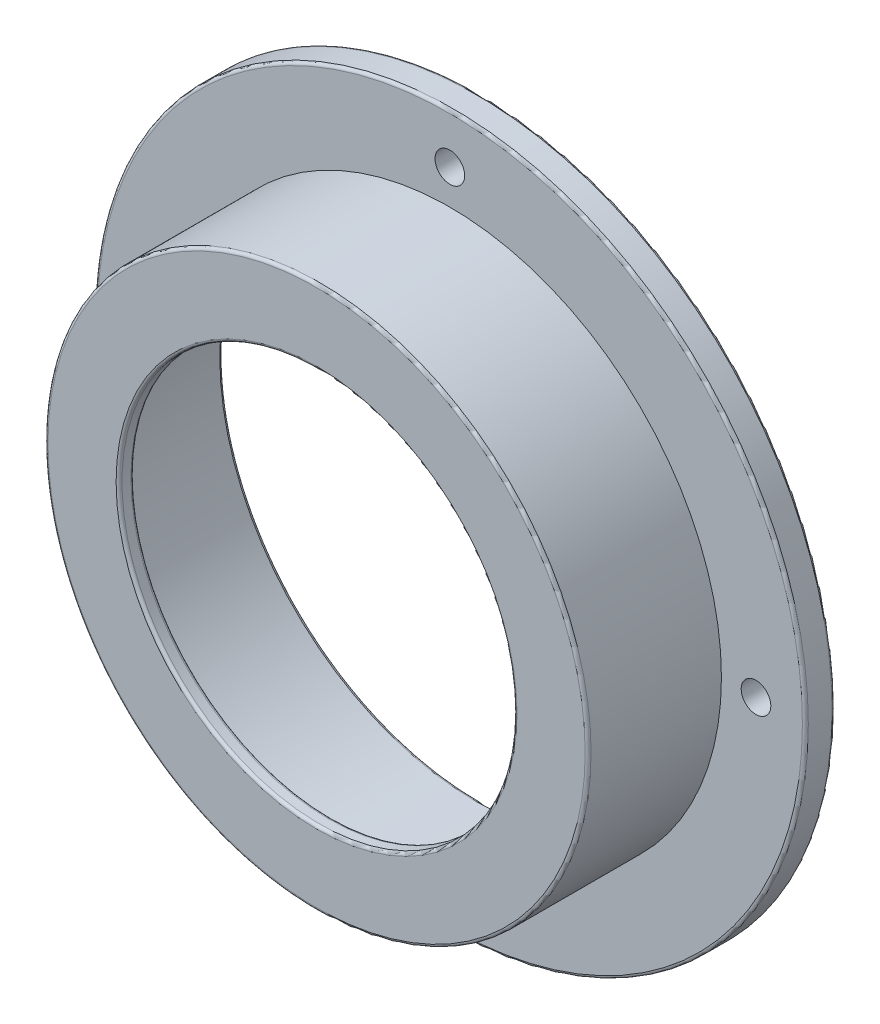
ISO-10303-21;
HEADER;
FILE_DESCRIPTION(('STEP AP214'),'2;1');
FILE_NAME('part.step','',(''),(''),'','','');
FILE_SCHEMA(('AUTOMOTIVE_DESIGN { 1 0 10303 214 1 1 1 1 }'));
ENDSEC;
DATA;
#1=APPLICATION_CONTEXT('core data for automotive mechanical design processes');
#2=APPLICATION_PROTOCOL_DEFINITION('international standard','automotive_design',2000,#1);
#3=PRODUCT_CONTEXT('',#1,'mechanical');
#4=PRODUCT('Part','Part','',(#3));
#5=PRODUCT_RELATED_PRODUCT_CATEGORY('part','',(#4));
#6=PRODUCT_DEFINITION_FORMATION('','',#4);
#7=PRODUCT_DEFINITION_CONTEXT('part definition',#1,'design');
#8=PRODUCT_DEFINITION('design','',#6,#7);
#9=PRODUCT_DEFINITION_SHAPE('','',#8);
#10=(LENGTH_UNIT() NAMED_UNIT(*) SI_UNIT(.MILLI.,.METRE.));
#11=(NAMED_UNIT(*) PLANE_ANGLE_UNIT() SI_UNIT($,.RADIAN.));
#12=(NAMED_UNIT(*) SI_UNIT($,.STERADIAN.) SOLID_ANGLE_UNIT());
#13=UNCERTAINTY_MEASURE_WITH_UNIT(LENGTH_MEASURE(1.E-05),#10,'distance_accuracy_value','');
#14=(GEOMETRIC_REPRESENTATION_CONTEXT(3) GLOBAL_UNCERTAINTY_ASSIGNED_CONTEXT((#13)) GLOBAL_UNIT_ASSIGNED_CONTEXT((#10,
#11,#12)) REPRESENTATION_CONTEXT('',''));
#15=CARTESIAN_POINT('',(0.,0.,0.));
#16=DIRECTION('',(0.,0.,1.));
#17=DIRECTION('',(1.,0.,0.));
#18=AXIS2_PLACEMENT_3D('',#15,#16,#17);
#19=CARTESIAN_POINT('',(0.,0.,3.));
#20=DIRECTION('',(0.,0.,-1.));
#21=DIRECTION('',(-1.,0.,0.));
#22=AXIS2_PLACEMENT_3D('',#19,#20,#21);
#23=CYLINDRICAL_SURFACE('',#22,36.);
#24=CARTESIAN_POINT('',(0.,0.,2.7));
#25=DIRECTION('',(0.,0.,1.));
#26=DIRECTION('',(1.,0.,0.));
#27=AXIS2_PLACEMENT_3D('',#24,#25,#26);
#28=CIRCLE('',#27,36.);
#29=CARTESIAN_POINT('',(36.,0.,2.7));
#30=VERTEX_POINT('',#29);
#31=EDGE_CURVE('E10',#30,#30,#28,.F.);
#32=ORIENTED_EDGE('',*,*,#31,.T.);
#33=EDGE_LOOP('',(#32));
#34=FACE_BOUND('',#33,.T.);
#35=CARTESIAN_POINT('',(0.,0.,0.3));
#36=DIRECTION('',(0.,0.,1.));
#37=DIRECTION('',(1.,0.,0.));
#38=AXIS2_PLACEMENT_3D('',#35,#36,#37);
#39=CIRCLE('',#38,36.);
#40=CARTESIAN_POINT('',(36.,0.,0.3));
#41=VERTEX_POINT('',#40);
#42=EDGE_CURVE('E41',#41,#41,#39,.T.);
#43=ORIENTED_EDGE('',*,*,#42,.T.);
#44=EDGE_LOOP('',(#43));
#45=FACE_BOUND('',#44,.T.);
#46=ADVANCED_FACE('F34',(#34,#45),#23,.T.);
#47=CARTESIAN_POINT('',(0.,0.,3.));
#48=DIRECTION('',(0.,0.,1.));
#49=DIRECTION('',(1.,0.,0.));
#50=AXIS2_PLACEMENT_3D('',#47,#48,#49);
#51=PLANE('',#50);
#52=CARTESIAN_POINT('',(0.,0.,3.));
#53=DIRECTION('',(0.,0.,1.));
#54=DIRECTION('',(1.,0.,0.));
#55=AXIS2_PLACEMENT_3D('',#52,#53,#54);
#56=CIRCLE('',#55,35.7);
#57=CARTESIAN_POINT('',(35.7,0.,3.));
#58=VERTEX_POINT('',#57);
#59=EDGE_CURVE('E45',#58,#58,#56,.T.);
#60=ORIENTED_EDGE('',*,*,#59,.T.);
#61=EDGE_LOOP('',(#60));
#62=FACE_BOUND('',#61,.T.);
#63=CARTESIAN_POINT('',(31.,-1.08235921504137E-13,3.));
#64=DIRECTION('',(0.,0.,-1.));
#65=DIRECTION('',(0.,1.,0.));
#66=AXIS2_PLACEMENT_3D('',#63,#64,#65);
#67=CIRCLE('',#66,1.5);
#68=CARTESIAN_POINT('',(31.,1.49999999999989,3.));
#69=VERTEX_POINT('',#68);
#70=EDGE_CURVE('E88',#69,#69,#67,.T.);
#71=ORIENTED_EDGE('',*,*,#70,.T.);
#72=EDGE_LOOP('',(#71));
#73=FACE_BOUND('',#72,.T.);
#74=CARTESIAN_POINT('',(0.,-31.,3.));
#75=DIRECTION('',(0.,0.,-1.));
#76=DIRECTION('',(1.,0.,0.));
#77=AXIS2_PLACEMENT_3D('',#74,#75,#76);
#78=CIRCLE('',#77,1.5);
#79=CARTESIAN_POINT('',(1.5,-31.,3.));
#80=VERTEX_POINT('',#79);
#81=EDGE_CURVE('E100',#80,#80,#78,.T.);
#82=ORIENTED_EDGE('',*,*,#81,.T.);
#83=EDGE_LOOP('',(#82));
#84=FACE_BOUND('',#83,.T.);
#85=CARTESIAN_POINT('',(-31.,3.24707764512411E-13,3.));
#86=DIRECTION('',(0.,0.,-1.));
#87=DIRECTION('',(0.,-1.,0.));
#88=AXIS2_PLACEMENT_3D('',#85,#86,#87);
#89=CIRCLE('',#88,1.5);
#90=CARTESIAN_POINT('',(-31.,-1.49999999999968,3.));
#91=VERTEX_POINT('',#90);
#92=EDGE_CURVE('E94',#91,#91,#89,.T.);
#93=ORIENTED_EDGE('',*,*,#92,.T.);
#94=EDGE_LOOP('',(#93));
#95=FACE_BOUND('',#94,.T.);
#96=CARTESIAN_POINT('',(0.,31.,3.));
#97=DIRECTION('',(0.,0.,-1.));
#98=DIRECTION('',(-1.,0.,0.));
#99=AXIS2_PLACEMENT_3D('',#96,#97,#98);
#100=CIRCLE('',#99,1.5);
#101=CARTESIAN_POINT('',(-1.5,31.,3.));
#102=VERTEX_POINT('',#101);
#103=EDGE_CURVE('E84',#102,#102,#100,.T.);
#104=ORIENTED_EDGE('',*,*,#103,.T.);
#105=EDGE_LOOP('',(#104));
#106=FACE_BOUND('',#105,.T.);
#107=CARTESIAN_POINT('',(0.,0.,3.));
#108=DIRECTION('',(0.,0.,1.));
#109=DIRECTION('',(1.,0.,0.));
#110=AXIS2_PLACEMENT_3D('',#107,#108,#109);
#111=CIRCLE('',#110,27.5);
#112=CARTESIAN_POINT('',(27.5,0.,3.));
#113=VERTEX_POINT('',#112);
#114=EDGE_CURVE('E78',#113,#113,#111,.T.);
#115=ORIENTED_EDGE('',*,*,#114,.F.);
#116=EDGE_LOOP('',(#115));
#117=FACE_BOUND('',#116,.T.);
#118=ADVANCED_FACE('F109',(#62,#73,#84,#95,#106,#117),#51,.T.);
#119=CARTESIAN_POINT('',(0.,0.,0.));
#120=DIRECTION('',(0.,0.,1.));
#121=DIRECTION('',(1.,0.,0.));
#122=AXIS2_PLACEMENT_3D('',#119,#120,#121);
#123=PLANE('',#122);
#124=CARTESIAN_POINT('',(0.,0.,0.));
#125=DIRECTION('',(0.,0.,1.));
#126=DIRECTION('',(1.,0.,0.));
#127=AXIS2_PLACEMENT_3D('',#124,#125,#126);
#128=CIRCLE('',#127,26.3);
#129=CARTESIAN_POINT('',(26.3,0.,0.));
#130=VERTEX_POINT('',#129);
#131=EDGE_CURVE('E54',#130,#130,#128,.T.);
#132=ORIENTED_EDGE('',*,*,#131,.T.);
#133=EDGE_LOOP('',(#132));
#134=FACE_BOUND('',#133,.T.);
#135=CARTESIAN_POINT('',(0.,0.,0.));
#136=DIRECTION('',(0.,0.,1.));
#137=DIRECTION('',(1.,0.,0.));
#138=AXIS2_PLACEMENT_3D('',#135,#136,#137);
#139=CIRCLE('',#138,35.7);
#140=CARTESIAN_POINT('',(35.7,0.,0.));
#141=VERTEX_POINT('',#140);
#142=EDGE_CURVE('E57',#141,#141,#139,.F.);
#143=ORIENTED_EDGE('',*,*,#142,.T.);
#144=EDGE_LOOP('',(#143));
#145=FACE_BOUND('',#144,.T.);
#146=CARTESIAN_POINT('',(31.,-1.08235921504137E-13,0.));
#147=DIRECTION('',(0.,0.,-1.));
#148=DIRECTION('',(0.,1.,0.));
#149=AXIS2_PLACEMENT_3D('',#146,#147,#148);
#150=CIRCLE('',#149,1.5);
#151=CARTESIAN_POINT('',(31.,1.49999999999989,0.));
#152=VERTEX_POINT('',#151);
#153=EDGE_CURVE('E103',#152,#152,#150,.T.);
#154=ORIENTED_EDGE('',*,*,#153,.F.);
#155=EDGE_LOOP('',(#154));
#156=FACE_BOUND('',#155,.T.);
#157=CARTESIAN_POINT('',(0.,-31.,0.));
#158=DIRECTION('',(0.,0.,-1.));
#159=DIRECTION('',(1.,0.,0.));
#160=AXIS2_PLACEMENT_3D('',#157,#158,#159);
#161=CIRCLE('',#160,1.5);
#162=CARTESIAN_POINT('',(1.5,-31.,0.));
#163=VERTEX_POINT('',#162);
#164=EDGE_CURVE('E97',#163,#163,#161,.T.);
#165=ORIENTED_EDGE('',*,*,#164,.F.);
#166=EDGE_LOOP('',(#165));
#167=FACE_BOUND('',#166,.T.);
#168=CARTESIAN_POINT('',(-31.,3.24707764512411E-13,0.));
#169=DIRECTION('',(0.,0.,-1.));
#170=DIRECTION('',(0.,-1.,0.));
#171=AXIS2_PLACEMENT_3D('',#168,#169,#170);
#172=CIRCLE('',#171,1.5);
#173=CARTESIAN_POINT('',(-31.,-1.49999999999968,0.));
#174=VERTEX_POINT('',#173);
#175=EDGE_CURVE('E91',#174,#174,#172,.T.);
#176=ORIENTED_EDGE('',*,*,#175,.F.);
#177=EDGE_LOOP('',(#176));
#178=FACE_BOUND('',#177,.T.);
#179=CARTESIAN_POINT('',(0.,31.,0.));
#180=DIRECTION('',(0.,0.,-1.));
#181=DIRECTION('',(-1.,0.,0.));
#182=AXIS2_PLACEMENT_3D('',#179,#180,#181);
#183=CIRCLE('',#182,1.5);
#184=CARTESIAN_POINT('',(-1.5,31.,0.));
#185=VERTEX_POINT('',#184);
#186=EDGE_CURVE('E85',#185,#185,#183,.T.);
#187=ORIENTED_EDGE('',*,*,#186,.F.);
#188=EDGE_LOOP('',(#187));
#189=FACE_BOUND('',#188,.T.);
#190=ADVANCED_FACE('F120',(#134,#145,#156,#167,#178,#189),#123,.F.);
#191=CARTESIAN_POINT('',(0.,0.,15.5));
#192=DIRECTION('',(0.,0.,-1.));
#193=DIRECTION('',(-1.,0.,0.));
#194=AXIS2_PLACEMENT_3D('',#191,#192,#193);
#195=CYLINDRICAL_SURFACE('',#194,27.5);
#196=CARTESIAN_POINT('',(0.,0.,16.2));
#197=DIRECTION('',(0.,0.,1.));
#198=DIRECTION('',(1.,0.,0.));
#199=AXIS2_PLACEMENT_3D('',#196,#197,#198);
#200=CIRCLE('',#199,27.5);
#201=CARTESIAN_POINT('',(27.5,0.,16.2));
#202=VERTEX_POINT('',#201);
#203=EDGE_CURVE('E49',#202,#202,#200,.F.);
#204=ORIENTED_EDGE('',*,*,#203,.T.);
#205=EDGE_LOOP('',(#204));
#206=FACE_BOUND('',#205,.T.);
#207=ORIENTED_EDGE('',*,*,#114,.T.);
#208=EDGE_LOOP('',(#207));
#209=FACE_BOUND('',#208,.T.);
#210=ADVANCED_FACE('F123',(#206,#209),#195,.T.);
#211=CARTESIAN_POINT('',(0.,0.,15.));
#212=DIRECTION('',(0.,0.,-1.));
#213=DIRECTION('',(-1.,0.,0.));
#214=AXIS2_PLACEMENT_3D('',#211,#212,#213);
#215=CYLINDRICAL_SURFACE('',#214,26.);
#216=CARTESIAN_POINT('',(0.,0.,0.3));
#217=DIRECTION('',(0.,0.,1.));
#218=DIRECTION('',(1.,0.,0.));
#219=AXIS2_PLACEMENT_3D('',#216,#217,#218);
#220=CIRCLE('',#219,26.);
#221=CARTESIAN_POINT('',(26.,0.,0.3));
#222=VERTEX_POINT('',#221);
#223=EDGE_CURVE('E60',#222,#222,#220,.F.);
#224=ORIENTED_EDGE('',*,*,#223,.T.);
#225=EDGE_LOOP('',(#224));
#226=FACE_BOUND('',#225,.T.);
#227=CARTESIAN_POINT('',(0.,0.,15.));
#228=DIRECTION('',(0.,0.,-1.));
#229=DIRECTION('',(-1.,0.,0.));
#230=AXIS2_PLACEMENT_3D('',#227,#228,#229);
#231=CIRCLE('',#230,26.);
#232=CARTESIAN_POINT('',(-26.,0.,15.));
#233=VERTEX_POINT('',#232);
#234=EDGE_CURVE('E81',#233,#233,#231,.T.);
#235=ORIENTED_EDGE('',*,*,#234,.F.);
#236=EDGE_LOOP('',(#235));
#237=FACE_BOUND('',#236,.T.);
#238=ADVANCED_FACE('F240',(#226,#237),#215,.F.);
#239=CARTESIAN_POINT('',(0.,0.,15.));
#240=DIRECTION('',(0.,0.,-1.));
#241=DIRECTION('',(-1.,0.,0.));
#242=AXIS2_PLACEMENT_3D('',#239,#240,#241);
#243=PLANE('',#242);
#244=CARTESIAN_POINT('',(0.,0.,15.));
#245=DIRECTION('',(0.,0.,-1.));
#246=DIRECTION('',(-1.,0.,0.));
#247=AXIS2_PLACEMENT_3D('',#244,#245,#246);
#248=CIRCLE('',#247,20.3);
#249=CARTESIAN_POINT('',(-20.3,0.,15.));
#250=VERTEX_POINT('',#249);
#251=EDGE_CURVE('E69',#250,#250,#248,.F.);
#252=ORIENTED_EDGE('',*,*,#251,.T.);
#253=EDGE_LOOP('',(#252));
#254=FACE_BOUND('',#253,.T.);
#255=ORIENTED_EDGE('',*,*,#234,.T.);
#256=EDGE_LOOP('',(#255));
#257=FACE_BOUND('',#256,.T.);
#258=ADVANCED_FACE('F144',(#254,#257),#243,.T.);
#259=CARTESIAN_POINT('',(0.,0.,16.5));
#260=DIRECTION('',(0.,0.,1.));
#261=DIRECTION('',(1.,0.,0.));
#262=AXIS2_PLACEMENT_3D('',#259,#260,#261);
#263=PLANE('',#262);
#264=CARTESIAN_POINT('',(0.,0.,16.5));
#265=DIRECTION('',(0.,0.,1.));
#266=DIRECTION('',(1.,0.,0.));
#267=AXIS2_PLACEMENT_3D('',#264,#265,#266);
#268=CIRCLE('',#267,20.3);
#269=CARTESIAN_POINT('',(20.3,0.,16.5));
#270=VERTEX_POINT('',#269);
#271=EDGE_CURVE('E63',#270,#270,#268,.F.);
#272=ORIENTED_EDGE('',*,*,#271,.T.);
#273=EDGE_LOOP('',(#272));
#274=FACE_BOUND('',#273,.T.);
#275=CARTESIAN_POINT('',(0.,0.,16.5));
#276=DIRECTION('',(0.,0.,1.));
#277=DIRECTION('',(1.,0.,0.));
#278=AXIS2_PLACEMENT_3D('',#275,#276,#277);
#279=CIRCLE('',#278,27.2);
#280=CARTESIAN_POINT('',(27.2,0.,16.5));
#281=VERTEX_POINT('',#280);
#282=EDGE_CURVE('E66',#281,#281,#279,.T.);
#283=ORIENTED_EDGE('',*,*,#282,.T.);
#284=EDGE_LOOP('',(#283));
#285=FACE_BOUND('',#284,.T.);
#286=ADVANCED_FACE('F135',(#274,#285),#263,.T.);
#287=CARTESIAN_POINT('',(0.,31.,3.));
#288=DIRECTION('',(0.,0.,-1.));
#289=DIRECTION('',(-1.,0.,0.));
#290=AXIS2_PLACEMENT_3D('',#287,#288,#289);
#291=CYLINDRICAL_SURFACE('',#290,1.5);
#292=ORIENTED_EDGE('',*,*,#103,.F.);
#293=EDGE_LOOP('',(#292));
#294=FACE_BOUND('',#293,.T.);
#295=ORIENTED_EDGE('',*,*,#186,.T.);
#296=EDGE_LOOP('',(#295));
#297=FACE_BOUND('',#296,.T.);
#298=ADVANCED_FACE('F132',(#294,#297),#291,.F.);
#299=CARTESIAN_POINT('',(-31.,3.24707764512411E-13,3.));
#300=DIRECTION('',(0.,0.,-1.));
#301=DIRECTION('',(-1.,0.,0.));
#302=AXIS2_PLACEMENT_3D('',#299,#300,#301);
#303=CYLINDRICAL_SURFACE('',#302,1.5);
#304=ORIENTED_EDGE('',*,*,#92,.F.);
#305=EDGE_LOOP('',(#304));
#306=FACE_BOUND('',#305,.T.);
#307=ORIENTED_EDGE('',*,*,#175,.T.);
#308=EDGE_LOOP('',(#307));
#309=FACE_BOUND('',#308,.T.);
#310=ADVANCED_FACE('F134',(#306,#309),#303,.F.);
#311=CARTESIAN_POINT('',(0.,-31.,3.));
#312=DIRECTION('',(0.,0.,-1.));
#313=DIRECTION('',(-1.,0.,0.));
#314=AXIS2_PLACEMENT_3D('',#311,#312,#313);
#315=CYLINDRICAL_SURFACE('',#314,1.5);
#316=ORIENTED_EDGE('',*,*,#81,.F.);
#317=EDGE_LOOP('',(#316));
#318=FACE_BOUND('',#317,.T.);
#319=ORIENTED_EDGE('',*,*,#164,.T.);
#320=EDGE_LOOP('',(#319));
#321=FACE_BOUND('',#320,.T.);
#322=ADVANCED_FACE('F116',(#318,#321),#315,.F.);
#323=CARTESIAN_POINT('',(31.,-1.08235921504137E-13,3.));
#324=DIRECTION('',(0.,0.,-1.));
#325=DIRECTION('',(-1.,0.,0.));
#326=AXIS2_PLACEMENT_3D('',#323,#324,#325);
#327=CYLINDRICAL_SURFACE('',#326,1.5);
#328=ORIENTED_EDGE('',*,*,#70,.F.);
#329=EDGE_LOOP('',(#328));
#330=FACE_BOUND('',#329,.T.);
#331=ORIENTED_EDGE('',*,*,#153,.T.);
#332=EDGE_LOOP('',(#331));
#333=FACE_BOUND('',#332,.T.);
#334=ADVANCED_FACE('F112',(#330,#333),#327,.F.);
#335=CARTESIAN_POINT('',(0.,0.,6.5));
#336=DIRECTION('',(0.,0.,1.));
#337=DIRECTION('',(1.,0.,0.));
#338=AXIS2_PLACEMENT_3D('',#335,#336,#337);
#339=CYLINDRICAL_SURFACE('',#338,20.);
#340=CARTESIAN_POINT('',(0.,0.,15.3));
#341=DIRECTION('',(0.,0.,-1.));
#342=DIRECTION('',(-1.,0.,0.));
#343=AXIS2_PLACEMENT_3D('',#340,#341,#342);
#344=CIRCLE('',#343,20.);
#345=CARTESIAN_POINT('',(-20.,0.,15.3));
#346=VERTEX_POINT('',#345);
#347=EDGE_CURVE('E72',#346,#346,#344,.T.);
#348=ORIENTED_EDGE('',*,*,#347,.T.);
#349=EDGE_LOOP('',(#348));
#350=FACE_BOUND('',#349,.T.);
#351=CARTESIAN_POINT('',(0.,0.,16.2));
#352=DIRECTION('',(0.,0.,1.));
#353=DIRECTION('',(1.,0.,0.));
#354=AXIS2_PLACEMENT_3D('',#351,#352,#353);
#355=CIRCLE('',#354,20.);
#356=CARTESIAN_POINT('',(20.,0.,16.2));
#357=VERTEX_POINT('',#356);
#358=EDGE_CURVE('E75',#357,#357,#355,.T.);
#359=ORIENTED_EDGE('',*,*,#358,.T.);
#360=EDGE_LOOP('',(#359));
#361=FACE_BOUND('',#360,.T.);
#362=ADVANCED_FACE('F115',(#350,#361),#339,.F.);
#363=CARTESIAN_POINT('',(0.,0.,15.3));
#364=DIRECTION('',(0.,0.,-1.));
#365=DIRECTION('',(-1.,0.,0.));
#366=AXIS2_PLACEMENT_3D('',#363,#364,#365);
#367=TOROIDAL_SURFACE('',#366,20.3,0.3);
#368=ORIENTED_EDGE('',*,*,#251,.F.);
#369=EDGE_LOOP('',(#368));
#370=FACE_BOUND('',#369,.T.);
#371=ORIENTED_EDGE('',*,*,#347,.F.);
#372=EDGE_LOOP('',(#371));
#373=FACE_BOUND('',#372,.T.);
#374=ADVANCED_FACE('F156',(#370,#373),#367,.T.);
#375=CARTESIAN_POINT('',(0.,0.,16.2));
#376=DIRECTION('',(0.,0.,1.));
#377=DIRECTION('',(1.,0.,0.));
#378=AXIS2_PLACEMENT_3D('',#375,#376,#377);
#379=TOROIDAL_SURFACE('',#378,20.3,0.3);
#380=ORIENTED_EDGE('',*,*,#271,.F.);
#381=EDGE_LOOP('',(#380));
#382=FACE_BOUND('',#381,.T.);
#383=ORIENTED_EDGE('',*,*,#358,.F.);
#384=EDGE_LOOP('',(#383));
#385=FACE_BOUND('',#384,.T.);
#386=ADVANCED_FACE('F159',(#382,#385),#379,.T.);
#387=CARTESIAN_POINT('',(0.,0.,0.3));
#388=DIRECTION('',(0.,0.,1.));
#389=DIRECTION('',(1.,0.,0.));
#390=AXIS2_PLACEMENT_3D('',#387,#388,#389);
#391=TOROIDAL_SURFACE('',#390,26.3,0.3);
#392=ORIENTED_EDGE('',*,*,#131,.F.);
#393=EDGE_LOOP('',(#392));
#394=FACE_BOUND('',#393,.T.);
#395=ORIENTED_EDGE('',*,*,#223,.F.);
#396=EDGE_LOOP('',(#395));
#397=FACE_BOUND('',#396,.T.);
#398=ADVANCED_FACE('F163',(#394,#397),#391,.T.);
#399=CARTESIAN_POINT('',(0.,0.,16.2));
#400=DIRECTION('',(0.,0.,1.));
#401=DIRECTION('',(1.,0.,0.));
#402=AXIS2_PLACEMENT_3D('',#399,#400,#401);
#403=TOROIDAL_SURFACE('',#402,27.2,0.3);
#404=ORIENTED_EDGE('',*,*,#203,.F.);
#405=EDGE_LOOP('',(#404));
#406=FACE_BOUND('',#405,.T.);
#407=ORIENTED_EDGE('',*,*,#282,.F.);
#408=EDGE_LOOP('',(#407));
#409=FACE_BOUND('',#408,.T.);
#410=ADVANCED_FACE('F167',(#406,#409),#403,.T.);
#411=CARTESIAN_POINT('',(0.,0.,2.7));
#412=DIRECTION('',(0.,0.,1.));
#413=DIRECTION('',(1.,0.,0.));
#414=AXIS2_PLACEMENT_3D('',#411,#412,#413);
#415=TOROIDAL_SURFACE('',#414,35.7,0.3);
#416=ORIENTED_EDGE('',*,*,#31,.F.);
#417=EDGE_LOOP('',(#416));
#418=FACE_BOUND('',#417,.T.);
#419=ORIENTED_EDGE('',*,*,#59,.F.);
#420=EDGE_LOOP('',(#419));
#421=FACE_BOUND('',#420,.T.);
#422=ADVANCED_FACE('F170',(#418,#421),#415,.T.);
#423=CARTESIAN_POINT('',(0.,0.,0.3));
#424=DIRECTION('',(0.,0.,1.));
#425=DIRECTION('',(1.,0.,0.));
#426=AXIS2_PLACEMENT_3D('',#423,#424,#425);
#427=TOROIDAL_SURFACE('',#426,35.7,0.3);
#428=ORIENTED_EDGE('',*,*,#142,.F.);
#429=EDGE_LOOP('',(#428));
#430=FACE_BOUND('',#429,.T.);
#431=ORIENTED_EDGE('',*,*,#42,.F.);
#432=EDGE_LOOP('',(#431));
#433=FACE_BOUND('',#432,.T.);
#434=ADVANCED_FACE('F36',(#430,#433),#427,.T.);
#435=CLOSED_SHELL('',(#46,#118,#190,#210,#238,#258,#286,#298,#310,#322,#334,#362,#374,#386,#398,
#410,#422,#434));
#436=MANIFOLD_SOLID_BREP('B2',#435);
#437=ADVANCED_BREP_SHAPE_REPRESENTATION('',(#18,#436),#14);
#438=SHAPE_DEFINITION_REPRESENTATION(#9,#437);
ENDSEC;
END-ISO-10303-21;
